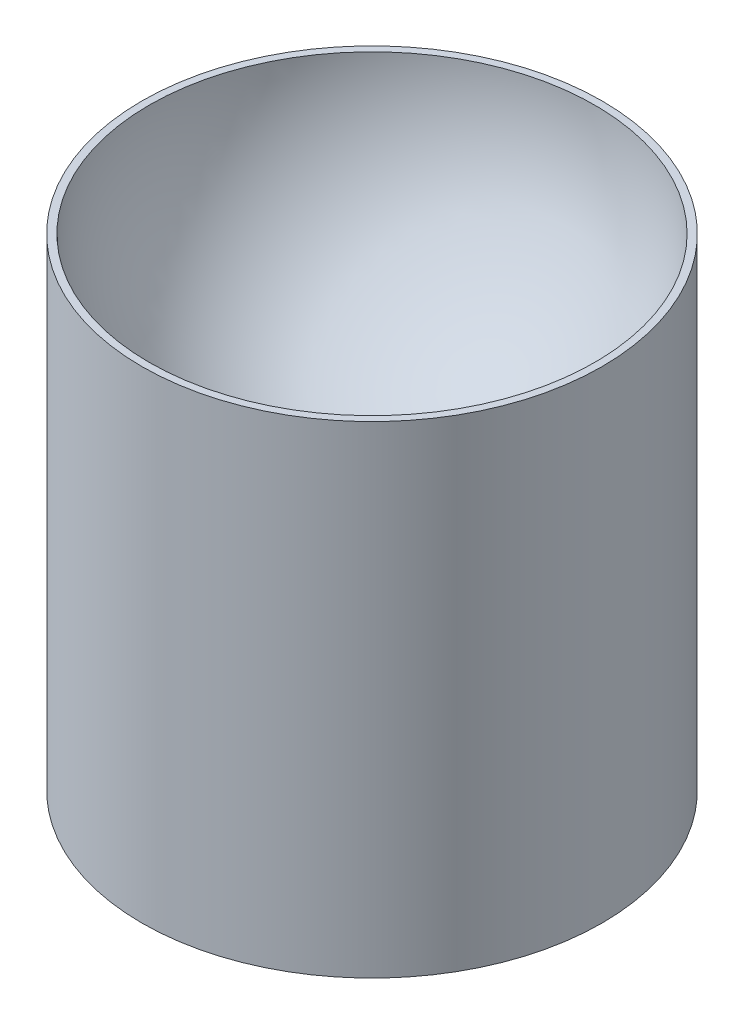
ISO-10303-21;
HEADER;
FILE_DESCRIPTION(('STEP AP214'),'2;1');
FILE_NAME('part.step','',(''),(''),'','','');
FILE_SCHEMA(('AUTOMOTIVE_DESIGN { 1 0 10303 214 1 1 1 1 }'));
ENDSEC;
DATA;
#1=APPLICATION_CONTEXT('core data for automotive mechanical design processes');
#2=APPLICATION_PROTOCOL_DEFINITION('international standard','automotive_design',2000,#1);
#3=PRODUCT_CONTEXT('',#1,'mechanical');
#4=PRODUCT('Part','Part','',(#3));
#5=PRODUCT_RELATED_PRODUCT_CATEGORY('part','',(#4));
#6=PRODUCT_DEFINITION_FORMATION('','',#4);
#7=PRODUCT_DEFINITION_CONTEXT('part definition',#1,'design');
#8=PRODUCT_DEFINITION('design','',#6,#7);
#9=PRODUCT_DEFINITION_SHAPE('','',#8);
#10=(LENGTH_UNIT() NAMED_UNIT(*) SI_UNIT(.MILLI.,.METRE.));
#11=(NAMED_UNIT(*) PLANE_ANGLE_UNIT() SI_UNIT($,.RADIAN.));
#12=(NAMED_UNIT(*) SI_UNIT($,.STERADIAN.) SOLID_ANGLE_UNIT());
#13=UNCERTAINTY_MEASURE_WITH_UNIT(LENGTH_MEASURE(1.E-05),#10,'distance_accuracy_value','');
#14=(GEOMETRIC_REPRESENTATION_CONTEXT(3) GLOBAL_UNCERTAINTY_ASSIGNED_CONTEXT((#13)) GLOBAL_UNIT_ASSIGNED_CONTEXT((#10,
#11,#12)) REPRESENTATION_CONTEXT('',''));
#15=CARTESIAN_POINT('',(0.,0.,0.));
#16=DIRECTION('',(0.,0.,1.));
#17=DIRECTION('',(1.,0.,0.));
#18=AXIS2_PLACEMENT_3D('',#15,#16,#17);
#19=CARTESIAN_POINT('',(-30.685,33.185,0.));
#20=DIRECTION('',(0.,1.,0.));
#21=DIRECTION('',(0.,0.,1.));
#22=AXIS2_PLACEMENT_3D('',#19,#20,#21);
#23=PLANE('',#22);
#24=CARTESIAN_POINT('',(0.,33.185,0.));
#25=DIRECTION('',(0.,1.,0.));
#26=DIRECTION('',(0.,0.,1.));
#27=AXIS2_PLACEMENT_3D('',#24,#25,#26);
#28=CIRCLE('',#27,31.685);
#29=CARTESIAN_POINT('',(0.,33.185,31.685));
#30=VERTEX_POINT('',#29);
#31=EDGE_CURVE('E54',#30,#30,#28,.T.);
#32=ORIENTED_EDGE('',*,*,#31,.T.);
#33=EDGE_LOOP('',(#32));
#34=FACE_BOUND('',#33,.T.);
#35=CARTESIAN_POINT('',(0.,33.185,0.));
#36=DIRECTION('',(0.,1.,0.));
#37=DIRECTION('',(0.,0.,1.));
#38=AXIS2_PLACEMENT_3D('',#35,#36,#37);
#39=CIRCLE('',#38,30.685);
#40=CARTESIAN_POINT('',(0.,33.185,30.685));
#41=VERTEX_POINT('',#40);
#42=EDGE_CURVE('E10',#41,#41,#39,.T.);
#43=ORIENTED_EDGE('',*,*,#42,.F.);
#44=EDGE_LOOP('',(#43));
#45=FACE_BOUND('',#44,.T.);
#46=ADVANCED_FACE('F37',(#34,#45),#23,.T.);
#47=CARTESIAN_POINT('',(0.,33.185,0.));
#48=DIRECTION('',(0.,1.,0.));
#49=DIRECTION('',(-1.,0.,0.));
#50=AXIS2_PLACEMENT_3D('',#47,#48,#49);
#51=SPHERICAL_SURFACE('',#50,30.685);
#52=ORIENTED_EDGE('',*,*,#42,.T.);
#53=EDGE_LOOP('',(#52));
#54=FACE_BOUND('',#53,.T.);
#55=ADVANCED_FACE('F74',(#54),#51,.F.);
#56=CARTESIAN_POINT('',(0.,-33.185,0.));
#57=DIRECTION('',(0.,1.,0.));
#58=DIRECTION('',(-1.,0.,0.));
#59=AXIS2_PLACEMENT_3D('',#56,#57,#58);
#60=SPHERICAL_SURFACE('',#59,30.685);
#61=CARTESIAN_POINT('',(0.,-33.185,0.));
#62=DIRECTION('',(0.,1.,0.));
#63=DIRECTION('',(0.,0.,1.));
#64=AXIS2_PLACEMENT_3D('',#61,#62,#63);
#65=CIRCLE('',#64,30.685);
#66=CARTESIAN_POINT('',(0.,-33.185,30.685));
#67=VERTEX_POINT('',#66);
#68=EDGE_CURVE('E44',#67,#67,#65,.T.);
#69=ORIENTED_EDGE('',*,*,#68,.F.);
#70=EDGE_LOOP('',(#69));
#71=FACE_BOUND('',#70,.T.);
#72=ADVANCED_FACE('F71',(#71),#60,.F.);
#73=CARTESIAN_POINT('',(-30.685,-33.185,0.));
#74=DIRECTION('',(0.,-1.,0.));
#75=DIRECTION('',(0.,0.,-1.));
#76=AXIS2_PLACEMENT_3D('',#73,#74,#75);
#77=PLANE('',#76);
#78=ORIENTED_EDGE('',*,*,#68,.T.);
#79=EDGE_LOOP('',(#78));
#80=FACE_BOUND('',#79,.T.);
#81=CARTESIAN_POINT('',(0.,-33.185,0.));
#82=DIRECTION('',(0.,1.,0.));
#83=DIRECTION('',(0.,0.,1.));
#84=AXIS2_PLACEMENT_3D('',#81,#82,#83);
#85=CIRCLE('',#84,31.685);
#86=CARTESIAN_POINT('',(0.,-33.185,31.685));
#87=VERTEX_POINT('',#86);
#88=EDGE_CURVE('E49',#87,#87,#85,.T.);
#89=ORIENTED_EDGE('',*,*,#88,.F.);
#90=EDGE_LOOP('',(#89));
#91=FACE_BOUND('',#90,.T.);
#92=ADVANCED_FACE('F65',(#80,#91),#77,.T.);
#93=CARTESIAN_POINT('',(0.,2.5,0.));
#94=DIRECTION('',(0.,1.,0.));
#95=DIRECTION('',(0.,0.,1.));
#96=AXIS2_PLACEMENT_3D('',#93,#94,#95);
#97=CYLINDRICAL_SURFACE('',#96,31.685);
#98=ORIENTED_EDGE('',*,*,#88,.T.);
#99=EDGE_LOOP('',(#98));
#100=FACE_BOUND('',#99,.T.);
#101=ORIENTED_EDGE('',*,*,#31,.F.);
#102=EDGE_LOOP('',(#101));
#103=FACE_BOUND('',#102,.T.);
#104=ADVANCED_FACE('F63',(#100,#103),#97,.T.);
#105=CLOSED_SHELL('',(#46,#55,#72,#92,#104));
#106=MANIFOLD_SOLID_BREP('B2',#105);
#107=ADVANCED_BREP_SHAPE_REPRESENTATION('',(#18,#106),#14);
#108=SHAPE_DEFINITION_REPRESENTATION(#9,#107);
ENDSEC;
END-ISO-10303-21;
